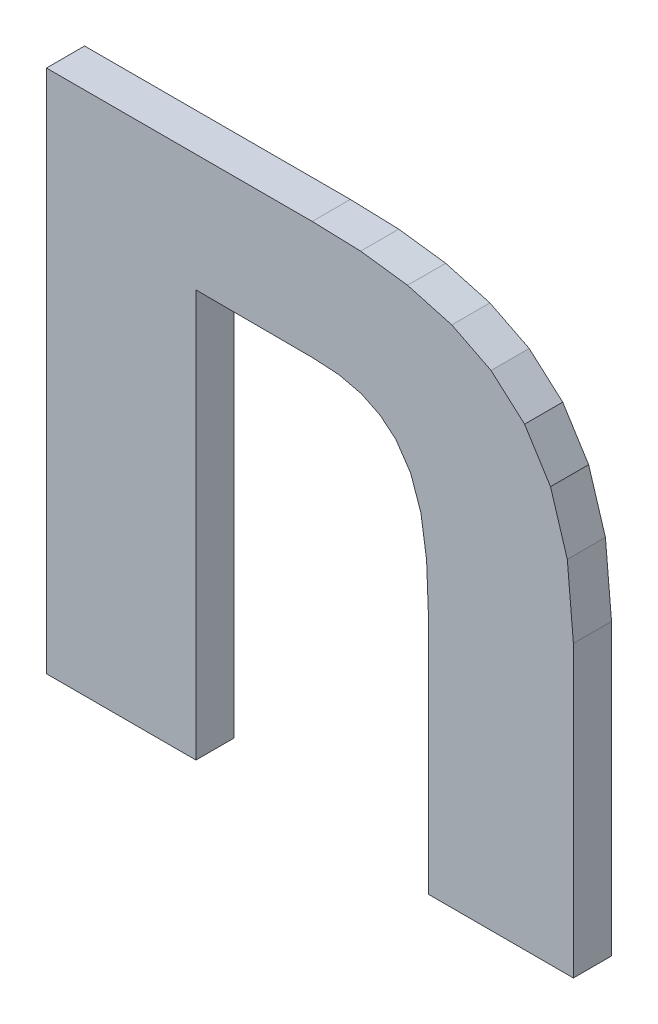
ISO-10303-21;
HEADER;
FILE_DESCRIPTION(('STEP AP214'),'2;1');
FILE_NAME('part.step','',(''),(''),'','','');
FILE_SCHEMA(('AUTOMOTIVE_DESIGN { 1 0 10303 214 1 1 1 1 }'));
ENDSEC;
DATA;
#1=APPLICATION_CONTEXT('core data for automotive mechanical design processes');
#2=APPLICATION_PROTOCOL_DEFINITION('international standard','automotive_design',2000,#1);
#3=PRODUCT_CONTEXT('',#1,'mechanical');
#4=PRODUCT('Part','Part','',(#3));
#5=PRODUCT_RELATED_PRODUCT_CATEGORY('part','',(#4));
#6=PRODUCT_DEFINITION_FORMATION('','',#4);
#7=PRODUCT_DEFINITION_CONTEXT('part definition',#1,'design');
#8=PRODUCT_DEFINITION('design','',#6,#7);
#9=PRODUCT_DEFINITION_SHAPE('','',#8);
#10=(LENGTH_UNIT() NAMED_UNIT(*) SI_UNIT(.MILLI.,.METRE.));
#11=(NAMED_UNIT(*) PLANE_ANGLE_UNIT() SI_UNIT($,.RADIAN.));
#12=(NAMED_UNIT(*) SI_UNIT($,.STERADIAN.) SOLID_ANGLE_UNIT());
#13=UNCERTAINTY_MEASURE_WITH_UNIT(LENGTH_MEASURE(1.E-05),#10,'distance_accuracy_value','');
#14=(GEOMETRIC_REPRESENTATION_CONTEXT(3) GLOBAL_UNCERTAINTY_ASSIGNED_CONTEXT((#13)) GLOBAL_UNIT_ASSIGNED_CONTEXT((#10,
#11,#12)) REPRESENTATION_CONTEXT('',''));
#15=CARTESIAN_POINT('',(0.,0.,0.));
#16=DIRECTION('',(0.,0.,1.));
#17=DIRECTION('',(1.,0.,0.));
#18=AXIS2_PLACEMENT_3D('',#15,#16,#17);
#19=CARTESIAN_POINT('',(0.,0.,0.));
#20=DIRECTION('',(0.,0.,1.));
#21=DIRECTION('',(1.,0.,0.));
#22=AXIS2_PLACEMENT_3D('',#19,#20,#21);
#23=PLANE('',#22);
#24=DIRECTION('',(-0.991645307551843,0.128994511551506,0.));
#25=VECTOR('',#24,1.);
#26=CARTESIAN_POINT('',(-2.806,-1.456,0.));
#27=LINE('',#26,#25);
#28=CARTESIAN_POINT('',(-2.806,-1.456,0.));
#29=VERTEX_POINT('',#28);
#30=CARTESIAN_POINT('',(-2.929,-1.44,0.));
#31=VERTEX_POINT('',#30);
#32=EDGE_CURVE('E294',#29,#31,#27,.T.);
#33=ORIENTED_EDGE('',*,*,#32,.F.);
#34=DIRECTION('',(-0.963992618206079,0.265928998125794,0.));
#35=VECTOR('',#34,1.);
#36=CARTESIAN_POINT('',(-2.69,-1.488,0.));
#37=LINE('',#36,#35);
#38=CARTESIAN_POINT('',(-2.69,-1.488,0.));
#39=VERTEX_POINT('',#38);
#40=EDGE_CURVE('E289',#39,#29,#37,.T.);
#41=ORIENTED_EDGE('',*,*,#40,.F.);
#42=DIRECTION('',(-0.892687099516335,0.450676982280118,0.));
#43=VECTOR('',#42,1.);
#44=CARTESIAN_POINT('',(-2.587,-1.54,0.));
#45=LINE('',#44,#43);
#46=CARTESIAN_POINT('',(-2.587,-1.54,0.));
#47=VERTEX_POINT('',#46);
#48=EDGE_CURVE('E284',#47,#39,#45,.T.);
#49=ORIENTED_EDGE('',*,*,#48,.F.);
#50=DIRECTION('',(-0.748346939228099,0.663307514315899,0.));
#51=VECTOR('',#50,1.);
#52=CARTESIAN_POINT('',(-2.499,-1.618,0.));
#53=LINE('',#52,#51);
#54=CARTESIAN_POINT('',(-2.499,-1.618,0.));
#55=VERTEX_POINT('',#54);
#56=EDGE_CURVE('E279',#55,#47,#53,.T.);
#57=ORIENTED_EDGE('',*,*,#56,.F.);
#58=DIRECTION('',(-0.532813269686134,0.846232840089754,0.));
#59=VECTOR('',#58,1.);
#60=CARTESIAN_POINT('',(-2.431,-1.726,0.));
#61=LINE('',#60,#59);
#62=CARTESIAN_POINT('',(-2.431,-1.726,0.));
#63=VERTEX_POINT('',#62);
#64=EDGE_CURVE('E274',#63,#55,#61,.T.);
#65=ORIENTED_EDGE('',*,*,#64,.F.);
#66=DIRECTION('',(-0.294085848837516,0.955779008721952,0.));
#67=VECTOR('',#66,1.);
#68=CARTESIAN_POINT('',(-2.387,-1.869,0.));
#69=LINE('',#68,#67);
#70=CARTESIAN_POINT('',(-2.387,-1.869,0.));
#71=VERTEX_POINT('',#70);
#72=EDGE_CURVE('E269',#71,#63,#69,.T.);
#73=ORIENTED_EDGE('',*,*,#72,.F.);
#74=DIRECTION('',(-0.0870994206802125,0.996199624029828,0.));
#75=VECTOR('',#74,1.);
#76=CARTESIAN_POINT('',(-2.371,-2.052,0.));
#77=LINE('',#76,#75);
#78=CARTESIAN_POINT('',(-2.371,-2.05199999999999,0.));
#79=VERTEX_POINT('',#78);
#80=EDGE_CURVE('E264',#79,#71,#77,.T.);
#81=ORIENTED_EDGE('',*,*,#80,.F.);
#82=DIRECTION('',(0.,1.,0.));
#83=VECTOR('',#82,1.);
#84=CARTESIAN_POINT('',(-2.371,-2.812,0.));
#85=LINE('',#84,#83);
#86=CARTESIAN_POINT('',(-2.371,-2.812,0.));
#87=VERTEX_POINT('',#86);
#88=EDGE_CURVE('E259',#87,#79,#85,.T.);
#89=ORIENTED_EDGE('',*,*,#88,.F.);
#90=DIRECTION('',(1.,0.,0.));
#91=VECTOR('',#90,1.);
#92=CARTESIAN_POINT('',(-2.751,-2.812,0.));
#93=LINE('',#92,#91);
#94=CARTESIAN_POINT('',(-2.751,-2.812,0.));
#95=VERTEX_POINT('',#94);
#96=EDGE_CURVE('E254',#95,#87,#93,.T.);
#97=ORIENTED_EDGE('',*,*,#96,.F.);
#98=DIRECTION('',(0.,1.,0.));
#99=VECTOR('',#98,1.);
#100=CARTESIAN_POINT('',(-2.751,-2.184,0.));
#101=LINE('',#100,#99);
#102=CARTESIAN_POINT('',(-2.751,-2.18399999999999,0.));
#103=VERTEX_POINT('',#102);
#104=EDGE_CURVE('E249',#103,#95,#101,.F.);
#105=ORIENTED_EDGE('',*,*,#104,.F.);
#106=DIRECTION('',(0.0387306080819815,-0.999249688515138,0.));
#107=VECTOR('',#106,1.);
#108=CARTESIAN_POINT('',(-2.756,-2.055,0.));
#109=LINE('',#108,#107);
#110=CARTESIAN_POINT('',(-2.756,-2.055,0.));
#111=VERTEX_POINT('',#110);
#112=EDGE_CURVE('E244',#111,#103,#109,.T.);
#113=ORIENTED_EDGE('',*,*,#112,.F.);
#114=DIRECTION('',(0.148340452930201,-0.988936352868304,0.));
#115=VECTOR('',#114,1.);
#116=CARTESIAN_POINT('',(-2.771,-1.955,0.));
#117=LINE('',#116,#115);
#118=CARTESIAN_POINT('',(-2.771,-1.955,0.));
#119=VERTEX_POINT('',#118);
#120=EDGE_CURVE('E239',#119,#111,#117,.T.);
#121=ORIENTED_EDGE('',*,*,#120,.F.);
#122=DIRECTION('',(0.330896267797115,-0.943667134088043,0.));
#123=VECTOR('',#122,1.);
#124=CARTESIAN_POINT('',(-2.798,-1.878,0.));
#125=LINE('',#124,#123);
#126=CARTESIAN_POINT('',(-2.798,-1.878,0.));
#127=VERTEX_POINT('',#126);
#128=EDGE_CURVE('E234',#127,#119,#125,.T.);
#129=ORIENTED_EDGE('',*,*,#128,.F.);
#130=DIRECTION('',(0.564683915592012,-0.825307261249817,0.));
#131=VECTOR('',#130,1.);
#132=CARTESIAN_POINT('',(-2.837,-1.821,0.));
#133=LINE('',#132,#131);
#134=CARTESIAN_POINT('',(-2.837,-1.821,0.));
#135=VERTEX_POINT('',#134);
#136=EDGE_CURVE('E229',#135,#127,#133,.T.);
#137=ORIENTED_EDGE('',*,*,#136,.F.);
#138=DIRECTION('',(0.76975796039341,-0.638335869594508,0.));
#139=VECTOR('',#138,1.);
#140=CARTESIAN_POINT('',(-2.878,-1.787,0.));
#141=LINE('',#140,#139);
#142=CARTESIAN_POINT('',(-2.878,-1.787,0.));
#143=VERTEX_POINT('',#142);
#144=EDGE_CURVE('E224',#143,#135,#141,.T.);
#145=ORIENTED_EDGE('',*,*,#144,.F.);
#146=DIRECTION('',(0.898062707987196,-0.439867448810098,0.));
#147=VECTOR('',#146,1.);
#148=CARTESIAN_POINT('',(-2.927,-1.763,0.));
#149=LINE('',#148,#147);
#150=CARTESIAN_POINT('',(-2.927,-1.763,0.));
#151=VERTEX_POINT('',#150);
#152=EDGE_CURVE('E219',#151,#143,#149,.T.);
#153=ORIENTED_EDGE('',*,*,#152,.F.);
#154=DIRECTION('',(0.972982875400533,-0.230877292467908,0.));
#155=VECTOR('',#154,1.);
#156=CARTESIAN_POINT('',(-2.986,-1.749,0.));
#157=LINE('',#156,#155);
#158=CARTESIAN_POINT('',(-2.986,-1.749,0.));
#159=VERTEX_POINT('',#158);
#160=EDGE_CURVE('E214',#159,#151,#157,.T.);
#161=ORIENTED_EDGE('',*,*,#160,.F.);
#162=DIRECTION('',(0.998371334423977,-0.0570497905385087,0.));
#163=VECTOR('',#162,1.);
#164=CARTESIAN_POINT('',(-3.056,-1.745,0.));
#165=LINE('',#164,#163);
#166=CARTESIAN_POINT('',(-3.056,-1.745,0.));
#167=VERTEX_POINT('',#166);
#168=EDGE_CURVE('E209',#167,#159,#165,.T.);
#169=ORIENTED_EDGE('',*,*,#168,.F.);
#170=DIRECTION('',(0.999994625144113,-0.00327867090211504,0.));
#171=VECTOR('',#170,1.);
#172=CARTESIAN_POINT('',(-3.361,-1.744,0.));
#173=LINE('',#172,#171);
#174=CARTESIAN_POINT('',(-3.361,-1.744,0.));
#175=VERTEX_POINT('',#174);
#176=EDGE_CURVE('E204',#175,#167,#173,.T.);
#177=ORIENTED_EDGE('',*,*,#176,.F.);
#178=DIRECTION('',(0.,1.,0.));
#179=VECTOR('',#178,1.);
#180=CARTESIAN_POINT('',(-3.361,-2.812,0.));
#181=LINE('',#180,#179);
#182=CARTESIAN_POINT('',(-3.361,-2.812,0.));
#183=VERTEX_POINT('',#182);
#184=EDGE_CURVE('E190',#183,#175,#181,.T.);
#185=ORIENTED_EDGE('',*,*,#184,.F.);
#186=DIRECTION('',(1.,0.,0.));
#187=VECTOR('',#186,1.);
#188=CARTESIAN_POINT('',(-3.753,-2.812,0.));
#189=LINE('',#188,#187);
#190=CARTESIAN_POINT('',(-3.753,-2.812,0.));
#191=VERTEX_POINT('',#190);
#192=EDGE_CURVE('E175',#191,#183,#189,.T.);
#193=ORIENTED_EDGE('',*,*,#192,.F.);
#194=DIRECTION('',(0.,1.,0.));
#195=VECTOR('',#194,1.);
#196=CARTESIAN_POINT('',(-3.753,-1.436,0.));
#197=LINE('',#196,#195);
#198=CARTESIAN_POINT('',(-3.753,-1.436,0.));
#199=VERTEX_POINT('',#198);
#200=EDGE_CURVE('E20',#199,#191,#197,.F.);
#201=ORIENTED_EDGE('',*,*,#200,.F.);
#202=DIRECTION('',(1.,0.,0.));
#203=VECTOR('',#202,1.);
#204=CARTESIAN_POINT('',(-3.056,-1.436,0.));
#205=LINE('',#204,#203);
#206=CARTESIAN_POINT('',(-3.05599999999985,-1.436,0.));
#207=VERTEX_POINT('',#206);
#208=EDGE_CURVE('E303',#207,#199,#205,.F.);
#209=ORIENTED_EDGE('',*,*,#208,.F.);
#210=DIRECTION('',(-0.999504367728677,0.0314804525268893,0.));
#211=VECTOR('',#210,1.);
#212=CARTESIAN_POINT('',(-2.929,-1.44,0.));
#213=LINE('',#212,#211);
#214=EDGE_CURVE('E299',#31,#207,#213,.T.);
#215=ORIENTED_EDGE('',*,*,#214,.F.);
#216=EDGE_LOOP('',(#33,#41,#49,#57,#65,#73,#81,#89,#97,#105,#113,#121,#129,#137,#145,#153,#161,
#169,#177,#185,#193,#201,#209,#215));
#217=FACE_BOUND('',#216,.T.);
#218=ADVANCED_FACE('F17',(#217),#23,.F.);
#219=CARTESIAN_POINT('',(-3.753,-1.436,0.));
#220=DIRECTION('',(-1.,0.,0.));
#221=DIRECTION('',(0.,0.,1.));
#222=AXIS2_PLACEMENT_3D('',#219,#220,#221);
#223=PLANE('',#222);
#224=DIRECTION('',(0.,0.,1.));
#225=VECTOR('',#224,1.);
#226=CARTESIAN_POINT('',(-3.753,-1.436,0.));
#227=LINE('',#226,#225);
#228=CARTESIAN_POINT('',(-3.753,-1.436,0.1));
#229=VERTEX_POINT('',#228);
#230=EDGE_CURVE('E184',#199,#229,#227,.T.);
#231=ORIENTED_EDGE('',*,*,#230,.F.);
#232=ORIENTED_EDGE('',*,*,#200,.T.);
#233=DIRECTION('',(0.,0.,-1.));
#234=VECTOR('',#233,1.);
#235=CARTESIAN_POINT('',(-3.753,-2.812,0.));
#236=LINE('',#235,#234);
#237=CARTESIAN_POINT('',(-3.753,-2.812,0.1));
#238=VERTEX_POINT('',#237);
#239=EDGE_CURVE('E181',#238,#191,#236,.T.);
#240=ORIENTED_EDGE('',*,*,#239,.F.);
#241=DIRECTION('',(0.,1.,0.));
#242=VECTOR('',#241,1.);
#243=CARTESIAN_POINT('',(-3.753,0.,0.1));
#244=LINE('',#243,#242);
#245=EDGE_CURVE('E305',#229,#238,#244,.F.);
#246=ORIENTED_EDGE('',*,*,#245,.F.);
#247=EDGE_LOOP('',(#231,#232,#240,#246));
#248=FACE_BOUND('',#247,.T.);
#249=ADVANCED_FACE('F180',(#248),#223,.T.);
#250=CARTESIAN_POINT('',(-3.753,-2.812,0.));
#251=DIRECTION('',(0.,-1.,0.));
#252=DIRECTION('',(0.,0.,-1.));
#253=AXIS2_PLACEMENT_3D('',#250,#251,#252);
#254=PLANE('',#253);
#255=ORIENTED_EDGE('',*,*,#239,.T.);
#256=ORIENTED_EDGE('',*,*,#192,.T.);
#257=DIRECTION('',(0.,0.,-1.));
#258=VECTOR('',#257,1.);
#259=CARTESIAN_POINT('',(-3.361,-2.812,0.));
#260=LINE('',#259,#258);
#261=CARTESIAN_POINT('',(-3.361,-2.812,0.1));
#262=VERTEX_POINT('',#261);
#263=EDGE_CURVE('E192',#262,#183,#260,.T.);
#264=ORIENTED_EDGE('',*,*,#263,.F.);
#265=DIRECTION('',(1.,0.,0.));
#266=VECTOR('',#265,1.);
#267=CARTESIAN_POINT('',(0.,-2.812,0.1));
#268=LINE('',#267,#266);
#269=EDGE_CURVE('E196',#238,#262,#268,.T.);
#270=ORIENTED_EDGE('',*,*,#269,.F.);
#271=EDGE_LOOP('',(#255,#256,#264,#270));
#272=FACE_BOUND('',#271,.T.);
#273=ADVANCED_FACE('F194',(#272),#254,.T.);
#274=CARTESIAN_POINT('',(-3.361,-2.812,0.));
#275=DIRECTION('',(1.,0.,0.));
#276=DIRECTION('',(0.,0.,-1.));
#277=AXIS2_PLACEMENT_3D('',#274,#275,#276);
#278=PLANE('',#277);
#279=ORIENTED_EDGE('',*,*,#263,.T.);
#280=ORIENTED_EDGE('',*,*,#184,.T.);
#281=DIRECTION('',(0.,0.,1.));
#282=VECTOR('',#281,1.);
#283=CARTESIAN_POINT('',(-3.361,-1.744,0.));
#284=LINE('',#283,#282);
#285=CARTESIAN_POINT('',(-3.361,-1.744,0.1));
#286=VERTEX_POINT('',#285);
#287=EDGE_CURVE('E201',#286,#175,#284,.F.);
#288=ORIENTED_EDGE('',*,*,#287,.F.);
#289=DIRECTION('',(0.,1.,0.));
#290=VECTOR('',#289,1.);
#291=CARTESIAN_POINT('',(-3.361,0.,0.1));
#292=LINE('',#291,#290);
#293=EDGE_CURVE('E308',#262,#286,#292,.T.);
#294=ORIENTED_EDGE('',*,*,#293,.F.);
#295=EDGE_LOOP('',(#279,#280,#288,#294));
#296=FACE_BOUND('',#295,.T.);
#297=ADVANCED_FACE('F462',(#296),#278,.T.);
#298=CARTESIAN_POINT('',(-3.361,-1.744,0.));
#299=DIRECTION('',(-0.00327867090211504,-0.999994625144113,0.));
#300=DIRECTION('',(0.999994625144113,-0.00327867090211504,0.));
#301=AXIS2_PLACEMENT_3D('',#298,#299,#300);
#302=PLANE('',#301);
#303=ORIENTED_EDGE('',*,*,#287,.T.);
#304=ORIENTED_EDGE('',*,*,#176,.T.);
#305=DIRECTION('',(0.,0.,1.));
#306=VECTOR('',#305,1.);
#307=CARTESIAN_POINT('',(-3.056,-1.745,0.));
#308=LINE('',#307,#306);
#309=CARTESIAN_POINT('',(-3.056,-1.745,0.1));
#310=VERTEX_POINT('',#309);
#311=EDGE_CURVE('E206',#310,#167,#308,.F.);
#312=ORIENTED_EDGE('',*,*,#311,.F.);
#313=DIRECTION('',(0.999994625144113,-0.00327867090211228,0.));
#314=VECTOR('',#313,1.);
#315=CARTESIAN_POINT('',(-3.361,-1.744,0.1));
#316=LINE('',#315,#314);
#317=EDGE_CURVE('E311',#286,#310,#316,.T.);
#318=ORIENTED_EDGE('',*,*,#317,.F.);
#319=EDGE_LOOP('',(#303,#304,#312,#318));
#320=FACE_BOUND('',#319,.T.);
#321=ADVANCED_FACE('F458',(#320),#302,.T.);
#322=CARTESIAN_POINT('',(-3.056,-1.745,0.));
#323=DIRECTION('',(-0.0570497905385087,-0.998371334423977,0.));
#324=DIRECTION('',(0.998371334423977,-0.0570497905385087,0.));
#325=AXIS2_PLACEMENT_3D('',#322,#323,#324);
#326=PLANE('',#325);
#327=ORIENTED_EDGE('',*,*,#311,.T.);
#328=ORIENTED_EDGE('',*,*,#168,.T.);
#329=DIRECTION('',(0.,0.,1.));
#330=VECTOR('',#329,1.);
#331=CARTESIAN_POINT('',(-2.986,-1.749,0.));
#332=LINE('',#331,#330);
#333=CARTESIAN_POINT('',(-2.986,-1.749,0.1));
#334=VERTEX_POINT('',#333);
#335=EDGE_CURVE('E211',#334,#159,#332,.F.);
#336=ORIENTED_EDGE('',*,*,#335,.F.);
#337=DIRECTION('',(0.998371334423977,-0.0570497905385114,0.));
#338=VECTOR('',#337,1.);
#339=CARTESIAN_POINT('',(-3.056,-1.745,0.1));
#340=LINE('',#339,#338);
#341=EDGE_CURVE('E314',#310,#334,#340,.T.);
#342=ORIENTED_EDGE('',*,*,#341,.F.);
#343=EDGE_LOOP('',(#327,#328,#336,#342));
#344=FACE_BOUND('',#343,.T.);
#345=ADVANCED_FACE('F454',(#344),#326,.T.);
#346=CARTESIAN_POINT('',(-2.986,-1.749,0.));
#347=DIRECTION('',(-0.230877292467908,-0.972982875400533,0.));
#348=DIRECTION('',(0.972982875400533,-0.230877292467908,0.));
#349=AXIS2_PLACEMENT_3D('',#346,#347,#348);
#350=PLANE('',#349);
#351=ORIENTED_EDGE('',*,*,#335,.T.);
#352=ORIENTED_EDGE('',*,*,#160,.T.);
#353=DIRECTION('',(0.,0.,1.));
#354=VECTOR('',#353,1.);
#355=CARTESIAN_POINT('',(-2.927,-1.763,0.));
#356=LINE('',#355,#354);
#357=CARTESIAN_POINT('',(-2.927,-1.763,0.1));
#358=VERTEX_POINT('',#357);
#359=EDGE_CURVE('E216',#358,#151,#356,.F.);
#360=ORIENTED_EDGE('',*,*,#359,.F.);
#361=DIRECTION('',(0.97298287540053,-0.230877292467919,0.));
#362=VECTOR('',#361,1.);
#363=CARTESIAN_POINT('',(-2.986,-1.749,0.1));
#364=LINE('',#363,#362);
#365=EDGE_CURVE('E317',#334,#358,#364,.T.);
#366=ORIENTED_EDGE('',*,*,#365,.F.);
#367=EDGE_LOOP('',(#351,#352,#360,#366));
#368=FACE_BOUND('',#367,.T.);
#369=ADVANCED_FACE('F450',(#368),#350,.T.);
#370=CARTESIAN_POINT('',(-2.927,-1.763,0.));
#371=DIRECTION('',(-0.439867448810098,-0.898062707987196,0.));
#372=DIRECTION('',(0.898062707987196,-0.439867448810098,0.));
#373=AXIS2_PLACEMENT_3D('',#370,#371,#372);
#374=PLANE('',#373);
#375=ORIENTED_EDGE('',*,*,#359,.T.);
#376=ORIENTED_EDGE('',*,*,#152,.T.);
#377=DIRECTION('',(0.,0.,1.));
#378=VECTOR('',#377,1.);
#379=CARTESIAN_POINT('',(-2.878,-1.787,0.));
#380=LINE('',#379,#378);
#381=CARTESIAN_POINT('',(-2.878,-1.787,0.1));
#382=VERTEX_POINT('',#381);
#383=EDGE_CURVE('E221',#382,#143,#380,.F.);
#384=ORIENTED_EDGE('',*,*,#383,.F.);
#385=DIRECTION('',(0.898062707987212,-0.439867448810066,0.));
#386=VECTOR('',#385,1.);
#387=CARTESIAN_POINT('',(-2.927,-1.763,0.1));
#388=LINE('',#387,#386);
#389=EDGE_CURVE('E320',#358,#382,#388,.T.);
#390=ORIENTED_EDGE('',*,*,#389,.F.);
#391=EDGE_LOOP('',(#375,#376,#384,#390));
#392=FACE_BOUND('',#391,.T.);
#393=ADVANCED_FACE('F446',(#392),#374,.T.);
#394=CARTESIAN_POINT('',(-2.878,-1.787,0.));
#395=DIRECTION('',(-0.638335869594508,-0.76975796039341,0.));
#396=DIRECTION('',(0.76975796039341,-0.638335869594508,0.));
#397=AXIS2_PLACEMENT_3D('',#394,#395,#396);
#398=PLANE('',#397);
#399=ORIENTED_EDGE('',*,*,#383,.T.);
#400=ORIENTED_EDGE('',*,*,#144,.T.);
#401=DIRECTION('',(0.,0.,1.));
#402=VECTOR('',#401,1.);
#403=CARTESIAN_POINT('',(-2.837,-1.821,0.));
#404=LINE('',#403,#402);
#405=CARTESIAN_POINT('',(-2.837,-1.821,0.1));
#406=VERTEX_POINT('',#405);
#407=EDGE_CURVE('E226',#406,#135,#404,.F.);
#408=ORIENTED_EDGE('',*,*,#407,.F.);
#409=DIRECTION('',(0.769757960393399,-0.638335869594522,0.));
#410=VECTOR('',#409,1.);
#411=CARTESIAN_POINT('',(-2.878,-1.787,0.1));
#412=LINE('',#411,#410);
#413=EDGE_CURVE('E323',#382,#406,#412,.T.);
#414=ORIENTED_EDGE('',*,*,#413,.F.);
#415=EDGE_LOOP('',(#399,#400,#408,#414));
#416=FACE_BOUND('',#415,.T.);
#417=ADVANCED_FACE('F442',(#416),#398,.T.);
#418=CARTESIAN_POINT('',(-2.837,-1.821,0.));
#419=DIRECTION('',(-0.825307261249817,-0.564683915592012,0.));
#420=DIRECTION('',(0.564683915592012,-0.825307261249817,0.));
#421=AXIS2_PLACEMENT_3D('',#418,#419,#420);
#422=PLANE('',#421);
#423=ORIENTED_EDGE('',*,*,#407,.T.);
#424=ORIENTED_EDGE('',*,*,#136,.T.);
#425=DIRECTION('',(0.,0.,1.));
#426=VECTOR('',#425,1.);
#427=CARTESIAN_POINT('',(-2.798,-1.878,0.));
#428=LINE('',#427,#426);
#429=CARTESIAN_POINT('',(-2.798,-1.878,0.1));
#430=VERTEX_POINT('',#429);
#431=EDGE_CURVE('E231',#430,#127,#428,.F.);
#432=ORIENTED_EDGE('',*,*,#431,.F.);
#433=DIRECTION('',(0.56468391559199,-0.825307261249832,0.));
#434=VECTOR('',#433,1.);
#435=CARTESIAN_POINT('',(-2.837,-1.821,0.1));
#436=LINE('',#435,#434);
#437=EDGE_CURVE('E326',#406,#430,#436,.T.);
#438=ORIENTED_EDGE('',*,*,#437,.F.);
#439=EDGE_LOOP('',(#423,#424,#432,#438));
#440=FACE_BOUND('',#439,.T.);
#441=ADVANCED_FACE('F438',(#440),#422,.T.);
#442=CARTESIAN_POINT('',(-2.798,-1.878,0.));
#443=DIRECTION('',(-0.943667134088043,-0.330896267797115,0.));
#444=DIRECTION('',(0.330896267797115,-0.943667134088043,0.));
#445=AXIS2_PLACEMENT_3D('',#442,#443,#444);
#446=PLANE('',#445);
#447=ORIENTED_EDGE('',*,*,#431,.T.);
#448=ORIENTED_EDGE('',*,*,#128,.T.);
#449=DIRECTION('',(0.,0.,1.));
#450=VECTOR('',#449,1.);
#451=CARTESIAN_POINT('',(-2.771,-1.955,0.));
#452=LINE('',#451,#450);
#453=CARTESIAN_POINT('',(-2.771,-1.955,0.1));
#454=VERTEX_POINT('',#453);
#455=EDGE_CURVE('E236',#454,#119,#452,.F.);
#456=ORIENTED_EDGE('',*,*,#455,.F.);
#457=DIRECTION('',(0.330896267797107,-0.943667134088045,0.));
#458=VECTOR('',#457,1.);
#459=CARTESIAN_POINT('',(-2.798,-1.878,0.1));
#460=LINE('',#459,#458);
#461=EDGE_CURVE('E329',#430,#454,#460,.T.);
#462=ORIENTED_EDGE('',*,*,#461,.F.);
#463=EDGE_LOOP('',(#447,#448,#456,#462));
#464=FACE_BOUND('',#463,.T.);
#465=ADVANCED_FACE('F434',(#464),#446,.T.);
#466=CARTESIAN_POINT('',(-2.771,-1.955,0.));
#467=DIRECTION('',(-0.988936352868304,-0.148340452930201,0.));
#468=DIRECTION('',(0.148340452930201,-0.988936352868304,0.));
#469=AXIS2_PLACEMENT_3D('',#466,#467,#468);
#470=PLANE('',#469);
#471=ORIENTED_EDGE('',*,*,#455,.T.);
#472=ORIENTED_EDGE('',*,*,#120,.T.);
#473=DIRECTION('',(0.,0.,1.));
#474=VECTOR('',#473,1.);
#475=CARTESIAN_POINT('',(-2.756,-2.055,0.));
#476=LINE('',#475,#474);
#477=CARTESIAN_POINT('',(-2.756,-2.055,0.1));
#478=VERTEX_POINT('',#477);
#479=EDGE_CURVE('E241',#478,#111,#476,.F.);
#480=ORIENTED_EDGE('',*,*,#479,.F.);
#481=DIRECTION('',(0.148340452930247,-0.988936352868297,0.));
#482=VECTOR('',#481,1.);
#483=CARTESIAN_POINT('',(-2.771,-1.955,0.1));
#484=LINE('',#483,#482);
#485=EDGE_CURVE('E332',#454,#478,#484,.T.);
#486=ORIENTED_EDGE('',*,*,#485,.F.);
#487=EDGE_LOOP('',(#471,#472,#480,#486));
#488=FACE_BOUND('',#487,.T.);
#489=ADVANCED_FACE('F430',(#488),#470,.T.);
#490=CARTESIAN_POINT('',(-2.756,-2.055,0.));
#491=DIRECTION('',(-0.999249688515138,-0.0387306080819815,0.));
#492=DIRECTION('',(0.0387306080819815,-0.999249688515138,0.));
#493=AXIS2_PLACEMENT_3D('',#490,#491,#492);
#494=PLANE('',#493);
#495=ORIENTED_EDGE('',*,*,#479,.T.);
#496=ORIENTED_EDGE('',*,*,#112,.T.);
#497=DIRECTION('',(0.,0.,1.));
#498=VECTOR('',#497,1.);
#499=CARTESIAN_POINT('',(-2.751,-2.184,0.));
#500=LINE('',#499,#498);
#501=CARTESIAN_POINT('',(-2.751,-2.18399999999999,0.1));
#502=VERTEX_POINT('',#501);
#503=EDGE_CURVE('E246',#502,#103,#500,.F.);
#504=ORIENTED_EDGE('',*,*,#503,.F.);
#505=DIRECTION('',(0.0387306080819806,-0.999249688515138,0.));
#506=VECTOR('',#505,1.);
#507=CARTESIAN_POINT('',(-2.756,-2.055,0.1));
#508=LINE('',#507,#506);
#509=EDGE_CURVE('E335',#478,#502,#508,.T.);
#510=ORIENTED_EDGE('',*,*,#509,.F.);
#511=EDGE_LOOP('',(#495,#496,#504,#510));
#512=FACE_BOUND('',#511,.T.);
#513=ADVANCED_FACE('F426',(#512),#494,.T.);
#514=CARTESIAN_POINT('',(-2.751,-2.184,0.));
#515=DIRECTION('',(-1.,0.,0.));
#516=DIRECTION('',(0.,0.,1.));
#517=AXIS2_PLACEMENT_3D('',#514,#515,#516);
#518=PLANE('',#517);
#519=ORIENTED_EDGE('',*,*,#503,.T.);
#520=ORIENTED_EDGE('',*,*,#104,.T.);
#521=DIRECTION('',(0.,0.,-1.));
#522=VECTOR('',#521,1.);
#523=CARTESIAN_POINT('',(-2.751,-2.812,0.));
#524=LINE('',#523,#522);
#525=CARTESIAN_POINT('',(-2.751,-2.812,0.1));
#526=VERTEX_POINT('',#525);
#527=EDGE_CURVE('E251',#526,#95,#524,.T.);
#528=ORIENTED_EDGE('',*,*,#527,.F.);
#529=DIRECTION('',(0.,1.,0.));
#530=VECTOR('',#529,1.);
#531=CARTESIAN_POINT('',(-2.751,0.,0.1));
#532=LINE('',#531,#530);
#533=EDGE_CURVE('E338',#502,#526,#532,.F.);
#534=ORIENTED_EDGE('',*,*,#533,.F.);
#535=EDGE_LOOP('',(#519,#520,#528,#534));
#536=FACE_BOUND('',#535,.T.);
#537=ADVANCED_FACE('F422',(#536),#518,.T.);
#538=CARTESIAN_POINT('',(-2.751,-2.812,0.));
#539=DIRECTION('',(0.,-1.,0.));
#540=DIRECTION('',(0.,0.,-1.));
#541=AXIS2_PLACEMENT_3D('',#538,#539,#540);
#542=PLANE('',#541);
#543=ORIENTED_EDGE('',*,*,#527,.T.);
#544=ORIENTED_EDGE('',*,*,#96,.T.);
#545=DIRECTION('',(0.,0.,-1.));
#546=VECTOR('',#545,1.);
#547=CARTESIAN_POINT('',(-2.371,-2.812,0.));
#548=LINE('',#547,#546);
#549=CARTESIAN_POINT('',(-2.371,-2.812,0.1));
#550=VERTEX_POINT('',#549);
#551=EDGE_CURVE('E256',#550,#87,#548,.T.);
#552=ORIENTED_EDGE('',*,*,#551,.F.);
#553=DIRECTION('',(1.,0.,0.));
#554=VECTOR('',#553,1.);
#555=CARTESIAN_POINT('',(0.,-2.812,0.1));
#556=LINE('',#555,#554);
#557=EDGE_CURVE('E341',#526,#550,#556,.T.);
#558=ORIENTED_EDGE('',*,*,#557,.F.);
#559=EDGE_LOOP('',(#543,#544,#552,#558));
#560=FACE_BOUND('',#559,.T.);
#561=ADVANCED_FACE('F418',(#560),#542,.T.);
#562=CARTESIAN_POINT('',(-2.371,-2.812,0.));
#563=DIRECTION('',(1.,0.,0.));
#564=DIRECTION('',(0.,0.,-1.));
#565=AXIS2_PLACEMENT_3D('',#562,#563,#564);
#566=PLANE('',#565);
#567=ORIENTED_EDGE('',*,*,#551,.T.);
#568=ORIENTED_EDGE('',*,*,#88,.T.);
#569=DIRECTION('',(0.,0.,1.));
#570=VECTOR('',#569,1.);
#571=CARTESIAN_POINT('',(-2.371,-2.052,0.));
#572=LINE('',#571,#570);
#573=CARTESIAN_POINT('',(-2.371,-2.05199999999999,0.1));
#574=VERTEX_POINT('',#573);
#575=EDGE_CURVE('E261',#574,#79,#572,.F.);
#576=ORIENTED_EDGE('',*,*,#575,.F.);
#577=DIRECTION('',(0.,1.,0.));
#578=VECTOR('',#577,1.);
#579=CARTESIAN_POINT('',(-2.371,0.,0.1));
#580=LINE('',#579,#578);
#581=EDGE_CURVE('E344',#550,#574,#580,.T.);
#582=ORIENTED_EDGE('',*,*,#581,.F.);
#583=EDGE_LOOP('',(#567,#568,#576,#582));
#584=FACE_BOUND('',#583,.T.);
#585=ADVANCED_FACE('F414',(#584),#566,.T.);
#586=CARTESIAN_POINT('',(-2.371,-2.052,0.));
#587=DIRECTION('',(0.996199624029828,0.0870994206802125,0.));
#588=DIRECTION('',(-0.0870994206802125,0.996199624029828,0.));
#589=AXIS2_PLACEMENT_3D('',#586,#587,#588);
#590=PLANE('',#589);
#591=ORIENTED_EDGE('',*,*,#575,.T.);
#592=ORIENTED_EDGE('',*,*,#80,.T.);
#593=DIRECTION('',(0.,0.,1.));
#594=VECTOR('',#593,1.);
#595=CARTESIAN_POINT('',(-2.387,-1.869,0.));
#596=LINE('',#595,#594);
#597=CARTESIAN_POINT('',(-2.387,-1.869,0.1));
#598=VERTEX_POINT('',#597);
#599=EDGE_CURVE('E266',#598,#71,#596,.F.);
#600=ORIENTED_EDGE('',*,*,#599,.F.);
#601=DIRECTION('',(-0.0870994206802057,0.996199624029829,0.));
#602=VECTOR('',#601,1.);
#603=CARTESIAN_POINT('',(-2.371,-2.052,0.1));
#604=LINE('',#603,#602);
#605=EDGE_CURVE('E347',#574,#598,#604,.T.);
#606=ORIENTED_EDGE('',*,*,#605,.F.);
#607=EDGE_LOOP('',(#591,#592,#600,#606));
#608=FACE_BOUND('',#607,.T.);
#609=ADVANCED_FACE('F410',(#608),#590,.T.);
#610=CARTESIAN_POINT('',(-2.387,-1.869,0.));
#611=DIRECTION('',(0.955779008721952,0.294085848837516,0.));
#612=DIRECTION('',(-0.294085848837516,0.955779008721952,0.));
#613=AXIS2_PLACEMENT_3D('',#610,#611,#612);
#614=PLANE('',#613);
#615=ORIENTED_EDGE('',*,*,#599,.T.);
#616=ORIENTED_EDGE('',*,*,#72,.T.);
#617=DIRECTION('',(0.,0.,1.));
#618=VECTOR('',#617,1.);
#619=CARTESIAN_POINT('',(-2.431,-1.726,0.));
#620=LINE('',#619,#618);
#621=CARTESIAN_POINT('',(-2.431,-1.726,0.1));
#622=VERTEX_POINT('',#621);
#623=EDGE_CURVE('E271',#622,#63,#620,.F.);
#624=ORIENTED_EDGE('',*,*,#623,.F.);
#625=DIRECTION('',(-0.294085848837522,0.95577900872195,0.));
#626=VECTOR('',#625,1.);
#627=CARTESIAN_POINT('',(-2.387,-1.869,0.1));
#628=LINE('',#627,#626);
#629=EDGE_CURVE('E350',#598,#622,#628,.T.);
#630=ORIENTED_EDGE('',*,*,#629,.F.);
#631=EDGE_LOOP('',(#615,#616,#624,#630));
#632=FACE_BOUND('',#631,.T.);
#633=ADVANCED_FACE('F406',(#632),#614,.T.);
#634=CARTESIAN_POINT('',(-2.431,-1.726,0.));
#635=DIRECTION('',(0.846232840089754,0.532813269686134,0.));
#636=DIRECTION('',(-0.532813269686134,0.846232840089754,0.));
#637=AXIS2_PLACEMENT_3D('',#634,#635,#636);
#638=PLANE('',#637);
#639=ORIENTED_EDGE('',*,*,#623,.T.);
#640=ORIENTED_EDGE('',*,*,#64,.T.);
#641=DIRECTION('',(0.,0.,1.));
#642=VECTOR('',#641,1.);
#643=CARTESIAN_POINT('',(-2.499,-1.618,0.));
#644=LINE('',#643,#642);
#645=CARTESIAN_POINT('',(-2.499,-1.618,0.1));
#646=VERTEX_POINT('',#645);
#647=EDGE_CURVE('E276',#646,#55,#644,.F.);
#648=ORIENTED_EDGE('',*,*,#647,.F.);
#649=DIRECTION('',(-0.532813269686141,0.84623284008975,0.));
#650=VECTOR('',#649,1.);
#651=CARTESIAN_POINT('',(-2.431,-1.726,0.1));
#652=LINE('',#651,#650);
#653=EDGE_CURVE('E353',#622,#646,#652,.T.);
#654=ORIENTED_EDGE('',*,*,#653,.F.);
#655=EDGE_LOOP('',(#639,#640,#648,#654));
#656=FACE_BOUND('',#655,.T.);
#657=ADVANCED_FACE('F402',(#656),#638,.T.);
#658=CARTESIAN_POINT('',(-2.499,-1.618,0.));
#659=DIRECTION('',(0.663307514315899,0.748346939228099,0.));
#660=DIRECTION('',(-0.748346939228099,0.663307514315899,0.));
#661=AXIS2_PLACEMENT_3D('',#658,#659,#660);
#662=PLANE('',#661);
#663=ORIENTED_EDGE('',*,*,#647,.T.);
#664=ORIENTED_EDGE('',*,*,#56,.T.);
#665=DIRECTION('',(0.,0.,1.));
#666=VECTOR('',#665,1.);
#667=CARTESIAN_POINT('',(-2.587,-1.54,0.));
#668=LINE('',#667,#666);
#669=CARTESIAN_POINT('',(-2.587,-1.54,0.1));
#670=VERTEX_POINT('',#669);
#671=EDGE_CURVE('E281',#670,#47,#668,.F.);
#672=ORIENTED_EDGE('',*,*,#671,.F.);
#673=DIRECTION('',(-0.748346939228141,0.663307514315852,0.));
#674=VECTOR('',#673,1.);
#675=CARTESIAN_POINT('',(-2.499,-1.618,0.1));
#676=LINE('',#675,#674);
#677=EDGE_CURVE('E356',#646,#670,#676,.T.);
#678=ORIENTED_EDGE('',*,*,#677,.F.);
#679=EDGE_LOOP('',(#663,#664,#672,#678));
#680=FACE_BOUND('',#679,.T.);
#681=ADVANCED_FACE('F398',(#680),#662,.T.);
#682=CARTESIAN_POINT('',(-2.587,-1.54,0.));
#683=DIRECTION('',(0.450676982280118,0.892687099516335,0.));
#684=DIRECTION('',(-0.892687099516335,0.450676982280118,0.));
#685=AXIS2_PLACEMENT_3D('',#682,#683,#684);
#686=PLANE('',#685);
#687=ORIENTED_EDGE('',*,*,#671,.T.);
#688=ORIENTED_EDGE('',*,*,#48,.T.);
#689=DIRECTION('',(0.,0.,1.));
#690=VECTOR('',#689,1.);
#691=CARTESIAN_POINT('',(-2.69,-1.488,0.));
#692=LINE('',#691,#690);
#693=CARTESIAN_POINT('',(-2.69,-1.488,0.1));
#694=VERTEX_POINT('',#693);
#695=EDGE_CURVE('E286',#694,#39,#692,.F.);
#696=ORIENTED_EDGE('',*,*,#695,.F.);
#697=DIRECTION('',(-0.892687099516344,0.450676982280099,0.));
#698=VECTOR('',#697,1.);
#699=CARTESIAN_POINT('',(-2.587,-1.54,0.1));
#700=LINE('',#699,#698);
#701=EDGE_CURVE('E359',#670,#694,#700,.T.);
#702=ORIENTED_EDGE('',*,*,#701,.F.);
#703=EDGE_LOOP('',(#687,#688,#696,#702));
#704=FACE_BOUND('',#703,.T.);
#705=ADVANCED_FACE('F394',(#704),#686,.T.);
#706=CARTESIAN_POINT('',(-2.69,-1.488,0.));
#707=DIRECTION('',(0.265928998125794,0.963992618206079,0.));
#708=DIRECTION('',(-0.963992618206079,0.265928998125794,0.));
#709=AXIS2_PLACEMENT_3D('',#706,#707,#708);
#710=PLANE('',#709);
#711=ORIENTED_EDGE('',*,*,#695,.T.);
#712=ORIENTED_EDGE('',*,*,#40,.T.);
#713=DIRECTION('',(0.,0.,1.));
#714=VECTOR('',#713,1.);
#715=CARTESIAN_POINT('',(-2.806,-1.456,0.));
#716=LINE('',#715,#714);
#717=CARTESIAN_POINT('',(-2.806,-1.456,0.1));
#718=VERTEX_POINT('',#717);
#719=EDGE_CURVE('E291',#718,#29,#716,.F.);
#720=ORIENTED_EDGE('',*,*,#719,.F.);
#721=DIRECTION('',(-0.963992618206074,0.265928998125813,0.));
#722=VECTOR('',#721,1.);
#723=CARTESIAN_POINT('',(-2.69,-1.488,0.1));
#724=LINE('',#723,#722);
#725=EDGE_CURVE('E362',#694,#718,#724,.T.);
#726=ORIENTED_EDGE('',*,*,#725,.F.);
#727=EDGE_LOOP('',(#711,#712,#720,#726));
#728=FACE_BOUND('',#727,.T.);
#729=ADVANCED_FACE('F391',(#728),#710,.T.);
#730=CARTESIAN_POINT('',(-2.806,-1.456,0.));
#731=DIRECTION('',(0.128994511551506,0.991645307551843,0.));
#732=DIRECTION('',(-0.991645307551843,0.128994511551506,0.));
#733=AXIS2_PLACEMENT_3D('',#730,#731,#732);
#734=PLANE('',#733);
#735=ORIENTED_EDGE('',*,*,#719,.T.);
#736=ORIENTED_EDGE('',*,*,#32,.T.);
#737=DIRECTION('',(0.,0.,1.));
#738=VECTOR('',#737,1.);
#739=CARTESIAN_POINT('',(-2.929,-1.44,0.));
#740=LINE('',#739,#738);
#741=CARTESIAN_POINT('',(-2.929,-1.44,0.1));
#742=VERTEX_POINT('',#741);
#743=EDGE_CURVE('E296',#742,#31,#740,.F.);
#744=ORIENTED_EDGE('',*,*,#743,.F.);
#745=DIRECTION('',(-0.991645307551848,0.128994511551461,0.));
#746=VECTOR('',#745,1.);
#747=CARTESIAN_POINT('',(-2.806,-1.456,0.1));
#748=LINE('',#747,#746);
#749=EDGE_CURVE('E365',#718,#742,#748,.T.);
#750=ORIENTED_EDGE('',*,*,#749,.F.);
#751=EDGE_LOOP('',(#735,#736,#744,#750));
#752=FACE_BOUND('',#751,.T.);
#753=ADVANCED_FACE('F375',(#752),#734,.T.);
#754=CARTESIAN_POINT('',(-2.929,-1.44,0.));
#755=DIRECTION('',(0.0314804525268893,0.999504367728677,0.));
#756=DIRECTION('',(-0.999504367728677,0.0314804525268893,0.));
#757=AXIS2_PLACEMENT_3D('',#754,#755,#756);
#758=PLANE('',#757);
#759=ORIENTED_EDGE('',*,*,#743,.T.);
#760=ORIENTED_EDGE('',*,*,#214,.T.);
#761=DIRECTION('',(0.,0.,1.));
#762=VECTOR('',#761,1.);
#763=CARTESIAN_POINT('',(-3.056,-1.436,0.));
#764=LINE('',#763,#762);
#765=CARTESIAN_POINT('',(-3.056,-1.436,0.1));
#766=VERTEX_POINT('',#765);
#767=EDGE_CURVE('E35',#766,#207,#764,.F.);
#768=ORIENTED_EDGE('',*,*,#767,.F.);
#769=DIRECTION('',(-0.999504367728677,0.0314804525268864,0.));
#770=VECTOR('',#769,1.);
#771=CARTESIAN_POINT('',(-2.929,-1.44,0.1));
#772=LINE('',#771,#770);
#773=EDGE_CURVE('E26',#742,#766,#772,.T.);
#774=ORIENTED_EDGE('',*,*,#773,.F.);
#775=EDGE_LOOP('',(#759,#760,#768,#774));
#776=FACE_BOUND('',#775,.T.);
#777=ADVANCED_FACE('F372',(#776),#758,.T.);
#778=CARTESIAN_POINT('',(-3.056,-1.436,0.));
#779=DIRECTION('',(0.,1.,0.));
#780=DIRECTION('',(0.,0.,1.));
#781=AXIS2_PLACEMENT_3D('',#778,#779,#780);
#782=PLANE('',#781);
#783=ORIENTED_EDGE('',*,*,#767,.T.);
#784=ORIENTED_EDGE('',*,*,#208,.T.);
#785=ORIENTED_EDGE('',*,*,#230,.T.);
#786=DIRECTION('',(1.,0.,0.));
#787=VECTOR('',#786,1.);
#788=CARTESIAN_POINT('',(0.,-1.436,0.1));
#789=LINE('',#788,#787);
#790=EDGE_CURVE('E11',#766,#229,#789,.F.);
#791=ORIENTED_EDGE('',*,*,#790,.F.);
#792=EDGE_LOOP('',(#783,#784,#785,#791));
#793=FACE_BOUND('',#792,.T.);
#794=ADVANCED_FACE('F378',(#793),#782,.T.);
#795=CARTESIAN_POINT('',(0.,0.,0.1));
#796=DIRECTION('',(0.,0.,1.));
#797=DIRECTION('',(1.,0.,0.));
#798=AXIS2_PLACEMENT_3D('',#795,#796,#797);
#799=PLANE('',#798);
#800=ORIENTED_EDGE('',*,*,#773,.T.);
#801=ORIENTED_EDGE('',*,*,#790,.T.);
#802=ORIENTED_EDGE('',*,*,#245,.T.);
#803=ORIENTED_EDGE('',*,*,#269,.T.);
#804=ORIENTED_EDGE('',*,*,#293,.T.);
#805=ORIENTED_EDGE('',*,*,#317,.T.);
#806=ORIENTED_EDGE('',*,*,#341,.T.);
#807=ORIENTED_EDGE('',*,*,#365,.T.);
#808=ORIENTED_EDGE('',*,*,#389,.T.);
#809=ORIENTED_EDGE('',*,*,#413,.T.);
#810=ORIENTED_EDGE('',*,*,#437,.T.);
#811=ORIENTED_EDGE('',*,*,#461,.T.);
#812=ORIENTED_EDGE('',*,*,#485,.T.);
#813=ORIENTED_EDGE('',*,*,#509,.T.);
#814=ORIENTED_EDGE('',*,*,#533,.T.);
#815=ORIENTED_EDGE('',*,*,#557,.T.);
#816=ORIENTED_EDGE('',*,*,#581,.T.);
#817=ORIENTED_EDGE('',*,*,#605,.T.);
#818=ORIENTED_EDGE('',*,*,#629,.T.);
#819=ORIENTED_EDGE('',*,*,#653,.T.);
#820=ORIENTED_EDGE('',*,*,#677,.T.);
#821=ORIENTED_EDGE('',*,*,#701,.T.);
#822=ORIENTED_EDGE('',*,*,#725,.T.);
#823=ORIENTED_EDGE('',*,*,#749,.T.);
#824=EDGE_LOOP('',(#800,#801,#802,#803,#804,#805,#806,#807,#808,#809,#810,#811,#812,#813,#814,
#815,#816,#817,#818,#819,#820,#821,#822,#823));
#825=FACE_BOUND('',#824,.T.);
#826=ADVANCED_FACE('F370',(#825),#799,.T.);
#827=CLOSED_SHELL('',(#218,#249,#273,#297,#321,#345,#369,#393,#417,#441,#465,#489,#513,#537,
#561,#585,#609,#633,#657,#681,#705,#729,#753,#777,#794,#826));
#828=MANIFOLD_SOLID_BREP('B1',#827);
#829=ADVANCED_BREP_SHAPE_REPRESENTATION('',(#18,#828),#14);
#830=SHAPE_DEFINITION_REPRESENTATION(#9,#829);
ENDSEC;
END-ISO-10303-21;
